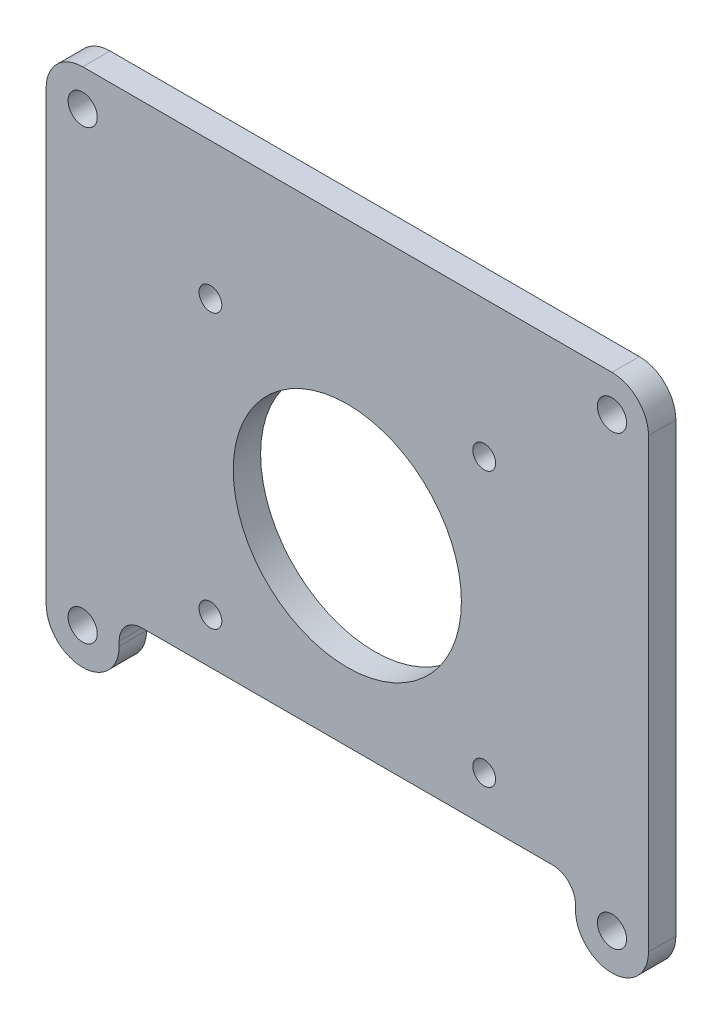
ISO-10303-21;
HEADER;
FILE_DESCRIPTION(('STEP AP214'),'2;1');
FILE_NAME('part.step','',(''),(''),'','','');
FILE_SCHEMA(('AUTOMOTIVE_DESIGN { 1 0 10303 214 1 1 1 1 }'));
ENDSEC;
DATA;
#1=APPLICATION_CONTEXT('core data for automotive mechanical design processes');
#2=APPLICATION_PROTOCOL_DEFINITION('international standard','automotive_design',2000,#1);
#3=PRODUCT_CONTEXT('',#1,'mechanical');
#4=PRODUCT('Part','Part','',(#3));
#5=PRODUCT_RELATED_PRODUCT_CATEGORY('part','',(#4));
#6=PRODUCT_DEFINITION_FORMATION('','',#4);
#7=PRODUCT_DEFINITION_CONTEXT('part definition',#1,'design');
#8=PRODUCT_DEFINITION('design','',#6,#7);
#9=PRODUCT_DEFINITION_SHAPE('','',#8);
#10=(LENGTH_UNIT() NAMED_UNIT(*) SI_UNIT(.MILLI.,.METRE.));
#11=(NAMED_UNIT(*) PLANE_ANGLE_UNIT() SI_UNIT($,.RADIAN.));
#12=(NAMED_UNIT(*) SI_UNIT($,.STERADIAN.) SOLID_ANGLE_UNIT());
#13=UNCERTAINTY_MEASURE_WITH_UNIT(LENGTH_MEASURE(1.E-05),#10,'distance_accuracy_value','');
#14=(GEOMETRIC_REPRESENTATION_CONTEXT(3) GLOBAL_UNCERTAINTY_ASSIGNED_CONTEXT((#13)) GLOBAL_UNIT_ASSIGNED_CONTEXT((#10,
#11,#12)) REPRESENTATION_CONTEXT('',''));
#15=CARTESIAN_POINT('',(0.,0.,0.));
#16=DIRECTION('',(0.,0.,1.));
#17=DIRECTION('',(1.,0.,0.));
#18=AXIS2_PLACEMENT_3D('',#15,#16,#17);
#19=CARTESIAN_POINT('',(-22.5,-2.5,3.));
#20=DIRECTION('',(0.,0.,-1.));
#21=DIRECTION('',(-1.,0.,0.));
#22=AXIS2_PLACEMENT_3D('',#19,#20,#21);
#23=PLANE('',#22);
#24=CARTESIAN_POINT('',(0.,20.,3.));
#25=DIRECTION('',(0.,0.,1.));
#26=DIRECTION('',(1.,0.,0.));
#27=AXIS2_PLACEMENT_3D('',#24,#25,#26);
#28=CIRCLE('',#27,12.5);
#29=CARTESIAN_POINT('',(12.5,20.,3.));
#30=VERTEX_POINT('',#29);
#31=EDGE_CURVE('E327',#30,#30,#28,.T.);
#32=ORIENTED_EDGE('',*,*,#31,.F.);
#33=EDGE_LOOP('',(#32));
#34=FACE_BOUND('',#33,.T.);
#35=CARTESIAN_POINT('',(15.,35.,3.));
#36=DIRECTION('',(0.,0.,1.));
#37=DIRECTION('',(1.,0.,0.));
#38=AXIS2_PLACEMENT_3D('',#35,#36,#37);
#39=CIRCLE('',#38,1.25);
#40=CARTESIAN_POINT('',(16.25,35.,3.));
#41=VERTEX_POINT('',#40);
#42=EDGE_CURVE('E321',#41,#41,#39,.T.);
#43=ORIENTED_EDGE('',*,*,#42,.F.);
#44=EDGE_LOOP('',(#43));
#45=FACE_BOUND('',#44,.T.);
#46=CARTESIAN_POINT('',(15.,5.,3.));
#47=DIRECTION('',(0.,0.,1.));
#48=DIRECTION('',(1.,0.,0.));
#49=AXIS2_PLACEMENT_3D('',#46,#47,#48);
#50=CIRCLE('',#49,1.25);
#51=CARTESIAN_POINT('',(16.25,5.,3.));
#52=VERTEX_POINT('',#51);
#53=EDGE_CURVE('E313',#52,#52,#50,.T.);
#54=ORIENTED_EDGE('',*,*,#53,.F.);
#55=EDGE_LOOP('',(#54));
#56=FACE_BOUND('',#55,.T.);
#57=CARTESIAN_POINT('',(-15.,5.,3.));
#58=DIRECTION('',(0.,0.,1.));
#59=DIRECTION('',(1.,0.,0.));
#60=AXIS2_PLACEMENT_3D('',#57,#58,#59);
#61=CIRCLE('',#60,1.25);
#62=CARTESIAN_POINT('',(-13.75,5.,3.));
#63=VERTEX_POINT('',#62);
#64=EDGE_CURVE('E306',#63,#63,#61,.T.);
#65=ORIENTED_EDGE('',*,*,#64,.F.);
#66=EDGE_LOOP('',(#65));
#67=FACE_BOUND('',#66,.T.);
#68=CARTESIAN_POINT('',(-15.,35.,3.));
#69=DIRECTION('',(0.,0.,1.));
#70=DIRECTION('',(1.,0.,0.));
#71=AXIS2_PLACEMENT_3D('',#68,#69,#70);
#72=CIRCLE('',#71,1.25);
#73=CARTESIAN_POINT('',(-13.75,35.,3.));
#74=VERTEX_POINT('',#73);
#75=EDGE_CURVE('E310',#74,#74,#72,.T.);
#76=ORIENTED_EDGE('',*,*,#75,.F.);
#77=EDGE_LOOP('',(#76));
#78=FACE_BOUND('',#77,.T.);
#79=CARTESIAN_POINT('',(-22.5,-2.5,3.));
#80=DIRECTION('',(0.,0.,-1.));
#81=DIRECTION('',(-1.,0.,0.));
#82=AXIS2_PLACEMENT_3D('',#79,#80,#81);
#83=CIRCLE('',#82,2.5);
#84=CARTESIAN_POINT('',(-25.,-2.5,3.));
#85=VERTEX_POINT('',#84);
#86=CARTESIAN_POINT('',(-22.5,0.,3.));
#87=VERTEX_POINT('',#86);
#88=EDGE_CURVE('E177',#85,#87,#83,.T.);
#89=ORIENTED_EDGE('',*,*,#88,.T.);
#90=DIRECTION('',(1.,0.,0.));
#91=VECTOR('',#90,1.);
#92=CARTESIAN_POINT('',(22.5,0.,3.));
#93=LINE('',#92,#91);
#94=CARTESIAN_POINT('',(22.5,0.,3.));
#95=VERTEX_POINT('',#94);
#96=EDGE_CURVE('E105',#87,#95,#93,.T.);
#97=ORIENTED_EDGE('',*,*,#96,.T.);
#98=CARTESIAN_POINT('',(22.5,-2.5,3.));
#99=DIRECTION('',(0.,0.,-1.));
#100=DIRECTION('',(1.,0.,0.));
#101=AXIS2_PLACEMENT_3D('',#98,#99,#100);
#102=CIRCLE('',#101,2.5);
#103=CARTESIAN_POINT('',(25.,-2.5,3.));
#104=VERTEX_POINT('',#103);
#105=EDGE_CURVE('E204',#95,#104,#102,.T.);
#106=ORIENTED_EDGE('',*,*,#105,.T.);
#107=DIRECTION('',(0.,-1.,0.));
#108=VECTOR('',#107,1.);
#109=CARTESIAN_POINT('',(25.,-2.5,3.));
#110=LINE('',#109,#108);
#111=CARTESIAN_POINT('',(25.,-3.00000000000001,3.));
#112=VERTEX_POINT('',#111);
#113=EDGE_CURVE('E223',#104,#112,#110,.T.);
#114=ORIENTED_EDGE('',*,*,#113,.T.);
#115=CARTESIAN_POINT('',(29.,-3.00000000000001,3.));
#116=DIRECTION('',(0.,0.,1.));
#117=DIRECTION('',(-1.,0.,0.));
#118=AXIS2_PLACEMENT_3D('',#115,#116,#117);
#119=CIRCLE('',#118,4.);
#120=CARTESIAN_POINT('',(33.,-3.00000000000001,3.));
#121=VERTEX_POINT('',#120);
#122=EDGE_CURVE('E220',#112,#121,#119,.T.);
#123=ORIENTED_EDGE('',*,*,#122,.T.);
#124=DIRECTION('',(0.,1.,0.));
#125=VECTOR('',#124,1.);
#126=CARTESIAN_POINT('',(33.,-3.00000000000001,3.));
#127=LINE('',#126,#125);
#128=CARTESIAN_POINT('',(33.,46.,3.));
#129=VERTEX_POINT('',#128);
#130=EDGE_CURVE('E222',#121,#129,#127,.T.);
#131=ORIENTED_EDGE('',*,*,#130,.T.);
#132=CARTESIAN_POINT('',(29.,46.,3.));
#133=DIRECTION('',(0.,0.,1.));
#134=DIRECTION('',(-1.,0.,0.));
#135=AXIS2_PLACEMENT_3D('',#132,#133,#134);
#136=CIRCLE('',#135,4.00000000000001);
#137=CARTESIAN_POINT('',(29.,50.,3.));
#138=VERTEX_POINT('',#137);
#139=EDGE_CURVE('E225',#129,#138,#136,.T.);
#140=ORIENTED_EDGE('',*,*,#139,.T.);
#141=DIRECTION('',(-1.,0.,0.));
#142=VECTOR('',#141,1.);
#143=CARTESIAN_POINT('',(-29.,50.,3.));
#144=LINE('',#143,#142);
#145=CARTESIAN_POINT('',(-29.,50.,3.));
#146=VERTEX_POINT('',#145);
#147=EDGE_CURVE('E231',#138,#146,#144,.T.);
#148=ORIENTED_EDGE('',*,*,#147,.T.);
#149=CARTESIAN_POINT('',(-29.,46.,3.));
#150=DIRECTION('',(0.,0.,1.));
#151=DIRECTION('',(1.,0.,0.));
#152=AXIS2_PLACEMENT_3D('',#149,#150,#151);
#153=CIRCLE('',#152,4.00000000000001);
#154=CARTESIAN_POINT('',(-33.,46.,3.));
#155=VERTEX_POINT('',#154);
#156=EDGE_CURVE('E136',#146,#155,#153,.T.);
#157=ORIENTED_EDGE('',*,*,#156,.T.);
#158=DIRECTION('',(0.,-1.,0.));
#159=VECTOR('',#158,1.);
#160=CARTESIAN_POINT('',(-33.,-3.00000000000001,3.));
#161=LINE('',#160,#159);
#162=CARTESIAN_POINT('',(-33.,-3.,3.));
#163=VERTEX_POINT('',#162);
#164=EDGE_CURVE('E130',#155,#163,#161,.T.);
#165=ORIENTED_EDGE('',*,*,#164,.T.);
#166=CARTESIAN_POINT('',(-29.,-3.00000000000001,3.));
#167=DIRECTION('',(0.,0.,1.));
#168=DIRECTION('',(1.,0.,0.));
#169=AXIS2_PLACEMENT_3D('',#166,#167,#168);
#170=CIRCLE('',#169,4.);
#171=CARTESIAN_POINT('',(-25.,-3.,3.));
#172=VERTEX_POINT('',#171);
#173=EDGE_CURVE('E134',#163,#172,#170,.T.);
#174=ORIENTED_EDGE('',*,*,#173,.T.);
#175=DIRECTION('',(0.,1.,0.));
#176=VECTOR('',#175,1.);
#177=CARTESIAN_POINT('',(-25.,-2.5,3.));
#178=LINE('',#177,#176);
#179=EDGE_CURVE('E50',#172,#85,#178,.T.);
#180=ORIENTED_EDGE('',*,*,#179,.T.);
#181=EDGE_LOOP('',(#89,#97,#106,#114,#123,#131,#140,#148,#157,#165,#174,#180));
#182=FACE_BOUND('',#181,.T.);
#183=CARTESIAN_POINT('',(-29.,-3.00000000000001,3.));
#184=DIRECTION('',(0.,0.,1.));
#185=DIRECTION('',(1.,0.,0.));
#186=AXIS2_PLACEMENT_3D('',#183,#184,#185);
#187=CIRCLE('',#186,1.6);
#188=CARTESIAN_POINT('',(-27.4,-3.00000000000001,3.));
#189=VERTEX_POINT('',#188);
#190=EDGE_CURVE('E158',#189,#189,#187,.T.);
#191=ORIENTED_EDGE('',*,*,#190,.F.);
#192=EDGE_LOOP('',(#191));
#193=FACE_BOUND('',#192,.T.);
#194=CARTESIAN_POINT('',(-29.,46.,3.));
#195=DIRECTION('',(0.,0.,1.));
#196=DIRECTION('',(1.,0.,0.));
#197=AXIS2_PLACEMENT_3D('',#194,#195,#196);
#198=CIRCLE('',#197,1.6);
#199=CARTESIAN_POINT('',(-27.4,46.,3.));
#200=VERTEX_POINT('',#199);
#201=EDGE_CURVE('E348',#200,#200,#198,.T.);
#202=ORIENTED_EDGE('',*,*,#201,.F.);
#203=EDGE_LOOP('',(#202));
#204=FACE_BOUND('',#203,.T.);
#205=CARTESIAN_POINT('',(29.,46.,3.));
#206=DIRECTION('',(0.,0.,1.));
#207=DIRECTION('',(-1.,0.,0.));
#208=AXIS2_PLACEMENT_3D('',#205,#206,#207);
#209=CIRCLE('',#208,1.6);
#210=CARTESIAN_POINT('',(27.4,46.,3.));
#211=VERTEX_POINT('',#210);
#212=EDGE_CURVE('E342',#211,#211,#209,.T.);
#213=ORIENTED_EDGE('',*,*,#212,.F.);
#214=EDGE_LOOP('',(#213));
#215=FACE_BOUND('',#214,.T.);
#216=CARTESIAN_POINT('',(29.,-3.00000000000001,3.));
#217=DIRECTION('',(0.,0.,1.));
#218=DIRECTION('',(-1.,0.,0.));
#219=AXIS2_PLACEMENT_3D('',#216,#217,#218);
#220=CIRCLE('',#219,1.6);
#221=CARTESIAN_POINT('',(27.4,-3.00000000000001,3.));
#222=VERTEX_POINT('',#221);
#223=EDGE_CURVE('E336',#222,#222,#220,.T.);
#224=ORIENTED_EDGE('',*,*,#223,.F.);
#225=EDGE_LOOP('',(#224));
#226=FACE_BOUND('',#225,.T.);
#227=ADVANCED_FACE('F33',(#34,#45,#56,#67,#78,#182,#193,#204,#215,#226),#23,.F.);
#228=CARTESIAN_POINT('',(-22.5,-2.5,0.));
#229=DIRECTION('',(0.,0.,-1.));
#230=DIRECTION('',(-1.,0.,0.));
#231=AXIS2_PLACEMENT_3D('',#228,#229,#230);
#232=PLANE('',#231);
#233=CARTESIAN_POINT('',(0.,20.,0.));
#234=DIRECTION('',(0.,0.,1.));
#235=DIRECTION('',(1.,0.,0.));
#236=AXIS2_PLACEMENT_3D('',#233,#234,#235);
#237=CIRCLE('',#236,12.5);
#238=CARTESIAN_POINT('',(12.5,20.,0.));
#239=VERTEX_POINT('',#238);
#240=EDGE_CURVE('E324',#239,#239,#237,.T.);
#241=ORIENTED_EDGE('',*,*,#240,.T.);
#242=EDGE_LOOP('',(#241));
#243=FACE_BOUND('',#242,.T.);
#244=CARTESIAN_POINT('',(15.,35.,0.));
#245=DIRECTION('',(0.,0.,1.));
#246=DIRECTION('',(1.,0.,0.));
#247=AXIS2_PLACEMENT_3D('',#244,#245,#246);
#248=CIRCLE('',#247,1.25);
#249=CARTESIAN_POINT('',(16.25,35.,0.));
#250=VERTEX_POINT('',#249);
#251=EDGE_CURVE('E318',#250,#250,#248,.T.);
#252=ORIENTED_EDGE('',*,*,#251,.T.);
#253=EDGE_LOOP('',(#252));
#254=FACE_BOUND('',#253,.T.);
#255=CARTESIAN_POINT('',(15.,5.,0.));
#256=DIRECTION('',(0.,0.,1.));
#257=DIRECTION('',(1.,0.,0.));
#258=AXIS2_PLACEMENT_3D('',#255,#256,#257);
#259=CIRCLE('',#258,1.25);
#260=CARTESIAN_POINT('',(16.25,5.,0.));
#261=VERTEX_POINT('',#260);
#262=EDGE_CURVE('E308',#261,#261,#259,.T.);
#263=ORIENTED_EDGE('',*,*,#262,.T.);
#264=EDGE_LOOP('',(#263));
#265=FACE_BOUND('',#264,.T.);
#266=CARTESIAN_POINT('',(-15.,5.,0.));
#267=DIRECTION('',(0.,0.,1.));
#268=DIRECTION('',(1.,0.,0.));
#269=AXIS2_PLACEMENT_3D('',#266,#267,#268);
#270=CIRCLE('',#269,1.25);
#271=CARTESIAN_POINT('',(-13.75,5.,0.));
#272=VERTEX_POINT('',#271);
#273=EDGE_CURVE('E303',#272,#272,#270,.T.);
#274=ORIENTED_EDGE('',*,*,#273,.T.);
#275=EDGE_LOOP('',(#274));
#276=FACE_BOUND('',#275,.T.);
#277=CARTESIAN_POINT('',(-15.,35.,0.));
#278=DIRECTION('',(0.,0.,1.));
#279=DIRECTION('',(1.,0.,0.));
#280=AXIS2_PLACEMENT_3D('',#277,#278,#279);
#281=CIRCLE('',#280,1.25);
#282=CARTESIAN_POINT('',(-13.75,35.,0.));
#283=VERTEX_POINT('',#282);
#284=EDGE_CURVE('E330',#283,#283,#281,.T.);
#285=ORIENTED_EDGE('',*,*,#284,.T.);
#286=EDGE_LOOP('',(#285));
#287=FACE_BOUND('',#286,.T.);
#288=CARTESIAN_POINT('',(29.,46.,0.));
#289=DIRECTION('',(0.,0.,1.));
#290=DIRECTION('',(-1.,0.,0.));
#291=AXIS2_PLACEMENT_3D('',#288,#289,#290);
#292=CIRCLE('',#291,1.6);
#293=CARTESIAN_POINT('',(27.4,46.,0.));
#294=VERTEX_POINT('',#293);
#295=EDGE_CURVE('E339',#294,#294,#292,.T.);
#296=ORIENTED_EDGE('',*,*,#295,.T.);
#297=EDGE_LOOP('',(#296));
#298=FACE_BOUND('',#297,.T.);
#299=CARTESIAN_POINT('',(-29.,-3.00000000000001,0.));
#300=DIRECTION('',(0.,0.,1.));
#301=DIRECTION('',(1.,0.,0.));
#302=AXIS2_PLACEMENT_3D('',#299,#300,#301);
#303=CIRCLE('',#302,1.6);
#304=CARTESIAN_POINT('',(-27.4,-3.00000000000001,0.));
#305=VERTEX_POINT('',#304);
#306=EDGE_CURVE('E351',#305,#305,#303,.T.);
#307=ORIENTED_EDGE('',*,*,#306,.T.);
#308=EDGE_LOOP('',(#307));
#309=FACE_BOUND('',#308,.T.);
#310=CARTESIAN_POINT('',(-22.5,-2.5,0.));
#311=DIRECTION('',(0.,0.,-1.));
#312=DIRECTION('',(-1.,0.,0.));
#313=AXIS2_PLACEMENT_3D('',#310,#311,#312);
#314=CIRCLE('',#313,2.5);
#315=CARTESIAN_POINT('',(-25.,-2.5,0.));
#316=VERTEX_POINT('',#315);
#317=CARTESIAN_POINT('',(-22.5,0.,0.));
#318=VERTEX_POINT('',#317);
#319=EDGE_CURVE('E154',#316,#318,#314,.T.);
#320=ORIENTED_EDGE('',*,*,#319,.F.);
#321=DIRECTION('',(0.,1.,0.));
#322=VECTOR('',#321,1.);
#323=CARTESIAN_POINT('',(-25.,-2.5,0.));
#324=LINE('',#323,#322);
#325=CARTESIAN_POINT('',(-25.,-3.,0.));
#326=VERTEX_POINT('',#325);
#327=EDGE_CURVE('E97',#326,#316,#324,.T.);
#328=ORIENTED_EDGE('',*,*,#327,.F.);
#329=CARTESIAN_POINT('',(-29.,-3.00000000000001,0.));
#330=DIRECTION('',(0.,0.,1.));
#331=DIRECTION('',(1.,0.,0.));
#332=AXIS2_PLACEMENT_3D('',#329,#330,#331);
#333=CIRCLE('',#332,4.);
#334=CARTESIAN_POINT('',(-33.,-3.,0.));
#335=VERTEX_POINT('',#334);
#336=EDGE_CURVE('E91',#335,#326,#333,.T.);
#337=ORIENTED_EDGE('',*,*,#336,.F.);
#338=DIRECTION('',(0.,-1.,0.));
#339=VECTOR('',#338,1.);
#340=CARTESIAN_POINT('',(-33.,-3.00000000000001,0.));
#341=LINE('',#340,#339);
#342=CARTESIAN_POINT('',(-33.,46.,0.));
#343=VERTEX_POINT('',#342);
#344=EDGE_CURVE('E144',#343,#335,#341,.T.);
#345=ORIENTED_EDGE('',*,*,#344,.F.);
#346=CARTESIAN_POINT('',(-29.,46.,0.));
#347=DIRECTION('',(0.,0.,1.));
#348=DIRECTION('',(1.,0.,0.));
#349=AXIS2_PLACEMENT_3D('',#346,#347,#348);
#350=CIRCLE('',#349,4.00000000000001);
#351=CARTESIAN_POINT('',(-29.,50.,0.));
#352=VERTEX_POINT('',#351);
#353=EDGE_CURVE('E172',#352,#343,#350,.T.);
#354=ORIENTED_EDGE('',*,*,#353,.F.);
#355=DIRECTION('',(-1.,0.,0.));
#356=VECTOR('',#355,1.);
#357=CARTESIAN_POINT('',(-29.,50.,0.));
#358=LINE('',#357,#356);
#359=CARTESIAN_POINT('',(29.,50.,0.));
#360=VERTEX_POINT('',#359);
#361=EDGE_CURVE('E170',#360,#352,#358,.T.);
#362=ORIENTED_EDGE('',*,*,#361,.F.);
#363=CARTESIAN_POINT('',(29.,46.,0.));
#364=DIRECTION('',(0.,0.,1.));
#365=DIRECTION('',(-1.,0.,0.));
#366=AXIS2_PLACEMENT_3D('',#363,#364,#365);
#367=CIRCLE('',#366,4.00000000000001);
#368=CARTESIAN_POINT('',(33.,46.,0.));
#369=VERTEX_POINT('',#368);
#370=EDGE_CURVE('E168',#369,#360,#367,.T.);
#371=ORIENTED_EDGE('',*,*,#370,.F.);
#372=DIRECTION('',(0.,1.,0.));
#373=VECTOR('',#372,1.);
#374=CARTESIAN_POINT('',(33.,-3.00000000000001,0.));
#375=LINE('',#374,#373);
#376=CARTESIAN_POINT('',(33.,-3.00000000000001,0.));
#377=VERTEX_POINT('',#376);
#378=EDGE_CURVE('E166',#377,#369,#375,.T.);
#379=ORIENTED_EDGE('',*,*,#378,.F.);
#380=CARTESIAN_POINT('',(29.,-3.00000000000001,0.));
#381=DIRECTION('',(0.,0.,1.));
#382=DIRECTION('',(-1.,0.,0.));
#383=AXIS2_PLACEMENT_3D('',#380,#381,#382);
#384=CIRCLE('',#383,4.);
#385=CARTESIAN_POINT('',(25.,-3.00000000000001,0.));
#386=VERTEX_POINT('',#385);
#387=EDGE_CURVE('E164',#386,#377,#384,.T.);
#388=ORIENTED_EDGE('',*,*,#387,.F.);
#389=DIRECTION('',(0.,-1.,0.));
#390=VECTOR('',#389,1.);
#391=CARTESIAN_POINT('',(25.,-2.5,0.));
#392=LINE('',#391,#390);
#393=CARTESIAN_POINT('',(25.,-2.5,0.));
#394=VERTEX_POINT('',#393);
#395=EDGE_CURVE('E162',#394,#386,#392,.T.);
#396=ORIENTED_EDGE('',*,*,#395,.F.);
#397=CARTESIAN_POINT('',(22.5,-2.5,0.));
#398=DIRECTION('',(0.,0.,-1.));
#399=DIRECTION('',(1.,0.,0.));
#400=AXIS2_PLACEMENT_3D('',#397,#398,#399);
#401=CIRCLE('',#400,2.5);
#402=CARTESIAN_POINT('',(22.5,0.,0.));
#403=VERTEX_POINT('',#402);
#404=EDGE_CURVE('E160',#403,#394,#401,.T.);
#405=ORIENTED_EDGE('',*,*,#404,.F.);
#406=DIRECTION('',(1.,0.,0.));
#407=VECTOR('',#406,1.);
#408=CARTESIAN_POINT('',(22.5,0.,0.));
#409=LINE('',#408,#407);
#410=EDGE_CURVE('E157',#318,#403,#409,.T.);
#411=ORIENTED_EDGE('',*,*,#410,.F.);
#412=EDGE_LOOP('',(#320,#328,#337,#345,#354,#362,#371,#379,#388,#396,#405,#411));
#413=FACE_BOUND('',#412,.T.);
#414=CARTESIAN_POINT('',(-29.,46.,0.));
#415=DIRECTION('',(0.,0.,1.));
#416=DIRECTION('',(1.,0.,0.));
#417=AXIS2_PLACEMENT_3D('',#414,#415,#416);
#418=CIRCLE('',#417,1.6);
#419=CARTESIAN_POINT('',(-27.4,46.,0.));
#420=VERTEX_POINT('',#419);
#421=EDGE_CURVE('E345',#420,#420,#418,.T.);
#422=ORIENTED_EDGE('',*,*,#421,.T.);
#423=EDGE_LOOP('',(#422));
#424=FACE_BOUND('',#423,.T.);
#425=CARTESIAN_POINT('',(29.,-3.00000000000001,0.));
#426=DIRECTION('',(0.,0.,1.));
#427=DIRECTION('',(-1.,0.,0.));
#428=AXIS2_PLACEMENT_3D('',#425,#426,#427);
#429=CIRCLE('',#428,1.6);
#430=CARTESIAN_POINT('',(27.4,-3.00000000000001,0.));
#431=VERTEX_POINT('',#430);
#432=EDGE_CURVE('E333',#431,#431,#429,.T.);
#433=ORIENTED_EDGE('',*,*,#432,.T.);
#434=EDGE_LOOP('',(#433));
#435=FACE_BOUND('',#434,.T.);
#436=ADVANCED_FACE('F208',(#243,#254,#265,#276,#287,#298,#309,#413,#424,#435),#232,.T.);
#437=CARTESIAN_POINT('',(-22.5,-2.5,3.));
#438=DIRECTION('',(0.,0.,-1.));
#439=DIRECTION('',(-1.,0.,0.));
#440=AXIS2_PLACEMENT_3D('',#437,#438,#439);
#441=CYLINDRICAL_SURFACE('',#440,2.5);
#442=ORIENTED_EDGE('',*,*,#319,.T.);
#443=DIRECTION('',(0.,0.,-1.));
#444=VECTOR('',#443,1.);
#445=CARTESIAN_POINT('',(-22.5,0.,3.));
#446=LINE('',#445,#444);
#447=EDGE_CURVE('E11',#87,#318,#446,.T.);
#448=ORIENTED_EDGE('',*,*,#447,.F.);
#449=ORIENTED_EDGE('',*,*,#88,.F.);
#450=DIRECTION('',(0.,0.,-1.));
#451=VECTOR('',#450,1.);
#452=CARTESIAN_POINT('',(-25.,-2.5,3.));
#453=LINE('',#452,#451);
#454=EDGE_CURVE('E150',#85,#316,#453,.T.);
#455=ORIENTED_EDGE('',*,*,#454,.T.);
#456=EDGE_LOOP('',(#442,#448,#449,#455));
#457=FACE_BOUND('',#456,.T.);
#458=ADVANCED_FACE('F35',(#457),#441,.F.);
#459=CARTESIAN_POINT('',(22.5,0.,3.));
#460=DIRECTION('',(0.,1.,0.));
#461=DIRECTION('',(0.,0.,1.));
#462=AXIS2_PLACEMENT_3D('',#459,#460,#461);
#463=PLANE('',#462);
#464=ORIENTED_EDGE('',*,*,#410,.T.);
#465=DIRECTION('',(0.,0.,-1.));
#466=VECTOR('',#465,1.);
#467=CARTESIAN_POINT('',(22.5,0.,3.));
#468=LINE('',#467,#466);
#469=EDGE_CURVE('E42',#95,#403,#468,.T.);
#470=ORIENTED_EDGE('',*,*,#469,.F.);
#471=ORIENTED_EDGE('',*,*,#96,.F.);
#472=ORIENTED_EDGE('',*,*,#447,.T.);
#473=EDGE_LOOP('',(#464,#470,#471,#472));
#474=FACE_BOUND('',#473,.T.);
#475=ADVANCED_FACE('F511',(#474),#463,.F.);
#476=CARTESIAN_POINT('',(22.5,-2.5,3.));
#477=DIRECTION('',(0.,0.,-1.));
#478=DIRECTION('',(-1.,0.,0.));
#479=AXIS2_PLACEMENT_3D('',#476,#477,#478);
#480=CYLINDRICAL_SURFACE('',#479,2.5);
#481=ORIENTED_EDGE('',*,*,#404,.T.);
#482=DIRECTION('',(0.,0.,-1.));
#483=VECTOR('',#482,1.);
#484=CARTESIAN_POINT('',(25.,-2.5,3.));
#485=LINE('',#484,#483);
#486=EDGE_CURVE('E196',#104,#394,#485,.T.);
#487=ORIENTED_EDGE('',*,*,#486,.F.);
#488=ORIENTED_EDGE('',*,*,#105,.F.);
#489=ORIENTED_EDGE('',*,*,#469,.T.);
#490=EDGE_LOOP('',(#481,#487,#488,#489));
#491=FACE_BOUND('',#490,.T.);
#492=ADVANCED_FACE('F202',(#491),#480,.F.);
#493=CARTESIAN_POINT('',(25.,-2.5,3.));
#494=DIRECTION('',(1.,0.,0.));
#495=DIRECTION('',(0.,0.,-1.));
#496=AXIS2_PLACEMENT_3D('',#493,#494,#495);
#497=PLANE('',#496);
#498=ORIENTED_EDGE('',*,*,#395,.T.);
#499=DIRECTION('',(0.,0.,-1.));
#500=VECTOR('',#499,1.);
#501=CARTESIAN_POINT('',(25.,-3.00000000000001,3.));
#502=LINE('',#501,#500);
#503=EDGE_CURVE('E193',#112,#386,#502,.T.);
#504=ORIENTED_EDGE('',*,*,#503,.F.);
#505=ORIENTED_EDGE('',*,*,#113,.F.);
#506=ORIENTED_EDGE('',*,*,#486,.T.);
#507=EDGE_LOOP('',(#498,#504,#505,#506));
#508=FACE_BOUND('',#507,.T.);
#509=ADVANCED_FACE('F214',(#508),#497,.F.);
#510=CARTESIAN_POINT('',(29.,-3.00000000000001,3.));
#511=DIRECTION('',(0.,0.,-1.));
#512=DIRECTION('',(-1.,0.,0.));
#513=AXIS2_PLACEMENT_3D('',#510,#511,#512);
#514=CYLINDRICAL_SURFACE('',#513,4.);
#515=ORIENTED_EDGE('',*,*,#387,.T.);
#516=DIRECTION('',(0.,0.,-1.));
#517=VECTOR('',#516,1.);
#518=CARTESIAN_POINT('',(33.,-3.00000000000001,3.));
#519=LINE('',#518,#517);
#520=EDGE_CURVE('E190',#121,#377,#519,.T.);
#521=ORIENTED_EDGE('',*,*,#520,.F.);
#522=ORIENTED_EDGE('',*,*,#122,.F.);
#523=ORIENTED_EDGE('',*,*,#503,.T.);
#524=EDGE_LOOP('',(#515,#521,#522,#523));
#525=FACE_BOUND('',#524,.T.);
#526=ADVANCED_FACE('F218',(#525),#514,.T.);
#527=CARTESIAN_POINT('',(33.,-3.00000000000001,3.));
#528=DIRECTION('',(-1.,0.,0.));
#529=DIRECTION('',(0.,-1.,0.));
#530=AXIS2_PLACEMENT_3D('',#527,#528,#529);
#531=PLANE('',#530);
#532=ORIENTED_EDGE('',*,*,#378,.T.);
#533=DIRECTION('',(0.,0.,-1.));
#534=VECTOR('',#533,1.);
#535=CARTESIAN_POINT('',(33.,46.,3.));
#536=LINE('',#535,#534);
#537=EDGE_CURVE('E187',#129,#369,#536,.T.);
#538=ORIENTED_EDGE('',*,*,#537,.F.);
#539=ORIENTED_EDGE('',*,*,#130,.F.);
#540=ORIENTED_EDGE('',*,*,#520,.T.);
#541=EDGE_LOOP('',(#532,#538,#539,#540));
#542=FACE_BOUND('',#541,.T.);
#543=ADVANCED_FACE('F480',(#542),#531,.F.);
#544=CARTESIAN_POINT('',(29.,46.,3.));
#545=DIRECTION('',(0.,0.,-1.));
#546=DIRECTION('',(-1.,0.,0.));
#547=AXIS2_PLACEMENT_3D('',#544,#545,#546);
#548=CYLINDRICAL_SURFACE('',#547,4.00000000000001);
#549=ORIENTED_EDGE('',*,*,#370,.T.);
#550=DIRECTION('',(0.,0.,-1.));
#551=VECTOR('',#550,1.);
#552=CARTESIAN_POINT('',(29.,50.,3.));
#553=LINE('',#552,#551);
#554=EDGE_CURVE('E184',#138,#360,#553,.T.);
#555=ORIENTED_EDGE('',*,*,#554,.F.);
#556=ORIENTED_EDGE('',*,*,#139,.F.);
#557=ORIENTED_EDGE('',*,*,#537,.T.);
#558=EDGE_LOOP('',(#549,#555,#556,#557));
#559=FACE_BOUND('',#558,.T.);
#560=ADVANCED_FACE('F472',(#559),#548,.T.);
#561=CARTESIAN_POINT('',(-29.,50.,3.));
#562=DIRECTION('',(0.,-1.,0.));
#563=DIRECTION('',(0.,0.,-1.));
#564=AXIS2_PLACEMENT_3D('',#561,#562,#563);
#565=PLANE('',#564);
#566=ORIENTED_EDGE('',*,*,#361,.T.);
#567=DIRECTION('',(0.,0.,-1.));
#568=VECTOR('',#567,1.);
#569=CARTESIAN_POINT('',(-29.,50.,3.));
#570=LINE('',#569,#568);
#571=EDGE_CURVE('E181',#146,#352,#570,.T.);
#572=ORIENTED_EDGE('',*,*,#571,.F.);
#573=ORIENTED_EDGE('',*,*,#147,.F.);
#574=ORIENTED_EDGE('',*,*,#554,.T.);
#575=EDGE_LOOP('',(#566,#572,#573,#574));
#576=FACE_BOUND('',#575,.T.);
#577=ADVANCED_FACE('F237',(#576),#565,.F.);
#578=CARTESIAN_POINT('',(-29.,46.,3.));
#579=DIRECTION('',(0.,0.,-1.));
#580=DIRECTION('',(-1.,0.,0.));
#581=AXIS2_PLACEMENT_3D('',#578,#579,#580);
#582=CYLINDRICAL_SURFACE('',#581,4.00000000000001);
#583=ORIENTED_EDGE('',*,*,#353,.T.);
#584=DIRECTION('',(0.,0.,-1.));
#585=VECTOR('',#584,1.);
#586=CARTESIAN_POINT('',(-33.,46.,3.));
#587=LINE('',#586,#585);
#588=EDGE_CURVE('E145',#155,#343,#587,.T.);
#589=ORIENTED_EDGE('',*,*,#588,.F.);
#590=ORIENTED_EDGE('',*,*,#156,.F.);
#591=ORIENTED_EDGE('',*,*,#571,.T.);
#592=EDGE_LOOP('',(#583,#589,#590,#591));
#593=FACE_BOUND('',#592,.T.);
#594=ADVANCED_FACE('F241',(#593),#582,.T.);
#595=CARTESIAN_POINT('',(-33.,-3.00000000000001,3.));
#596=DIRECTION('',(1.,0.,0.));
#597=DIRECTION('',(0.,1.,0.));
#598=AXIS2_PLACEMENT_3D('',#595,#596,#597);
#599=PLANE('',#598);
#600=ORIENTED_EDGE('',*,*,#344,.T.);
#601=DIRECTION('',(0.,0.,-1.));
#602=VECTOR('',#601,1.);
#603=CARTESIAN_POINT('',(-33.,-3.,3.));
#604=LINE('',#603,#602);
#605=EDGE_CURVE('E141',#163,#335,#604,.T.);
#606=ORIENTED_EDGE('',*,*,#605,.F.);
#607=ORIENTED_EDGE('',*,*,#164,.F.);
#608=ORIENTED_EDGE('',*,*,#588,.T.);
#609=EDGE_LOOP('',(#600,#606,#607,#608));
#610=FACE_BOUND('',#609,.T.);
#611=ADVANCED_FACE('F142',(#610),#599,.F.);
#612=CARTESIAN_POINT('',(-29.,-3.00000000000001,3.));
#613=DIRECTION('',(0.,0.,-1.));
#614=DIRECTION('',(-1.,0.,0.));
#615=AXIS2_PLACEMENT_3D('',#612,#613,#614);
#616=CYLINDRICAL_SURFACE('',#615,4.);
#617=ORIENTED_EDGE('',*,*,#336,.T.);
#618=DIRECTION('',(0.,0.,-1.));
#619=VECTOR('',#618,1.);
#620=CARTESIAN_POINT('',(-25.,-3.,3.));
#621=LINE('',#620,#619);
#622=EDGE_CURVE('E146',#172,#326,#621,.T.);
#623=ORIENTED_EDGE('',*,*,#622,.F.);
#624=ORIENTED_EDGE('',*,*,#173,.F.);
#625=ORIENTED_EDGE('',*,*,#605,.T.);
#626=EDGE_LOOP('',(#617,#623,#624,#625));
#627=FACE_BOUND('',#626,.T.);
#628=ADVANCED_FACE('F148',(#627),#616,.T.);
#629=CARTESIAN_POINT('',(-25.,-2.5,3.));
#630=DIRECTION('',(-1.,0.,0.));
#631=DIRECTION('',(0.,0.,1.));
#632=AXIS2_PLACEMENT_3D('',#629,#630,#631);
#633=PLANE('',#632);
#634=ORIENTED_EDGE('',*,*,#327,.T.);
#635=ORIENTED_EDGE('',*,*,#454,.F.);
#636=ORIENTED_EDGE('',*,*,#179,.F.);
#637=ORIENTED_EDGE('',*,*,#622,.T.);
#638=EDGE_LOOP('',(#634,#635,#636,#637));
#639=FACE_BOUND('',#638,.T.);
#640=ADVANCED_FACE('F245',(#639),#633,.F.);
#641=CARTESIAN_POINT('',(-29.,-3.00000000000001,3.));
#642=DIRECTION('',(0.,0.,-1.));
#643=DIRECTION('',(-1.,0.,0.));
#644=AXIS2_PLACEMENT_3D('',#641,#642,#643);
#645=CYLINDRICAL_SURFACE('',#644,1.6);
#646=ORIENTED_EDGE('',*,*,#190,.T.);
#647=EDGE_LOOP('',(#646));
#648=FACE_BOUND('',#647,.T.);
#649=ORIENTED_EDGE('',*,*,#306,.F.);
#650=EDGE_LOOP('',(#649));
#651=FACE_BOUND('',#650,.T.);
#652=ADVANCED_FACE('F247',(#648,#651),#645,.F.);
#653=CARTESIAN_POINT('',(-29.,46.,3.));
#654=DIRECTION('',(0.,0.,-1.));
#655=DIRECTION('',(-1.,0.,0.));
#656=AXIS2_PLACEMENT_3D('',#653,#654,#655);
#657=CYLINDRICAL_SURFACE('',#656,1.6);
#658=ORIENTED_EDGE('',*,*,#201,.T.);
#659=EDGE_LOOP('',(#658));
#660=FACE_BOUND('',#659,.T.);
#661=ORIENTED_EDGE('',*,*,#421,.F.);
#662=EDGE_LOOP('',(#661));
#663=FACE_BOUND('',#662,.T.);
#664=ADVANCED_FACE('F253',(#660,#663),#657,.F.);
#665=CARTESIAN_POINT('',(29.,46.,3.));
#666=DIRECTION('',(0.,0.,-1.));
#667=DIRECTION('',(-1.,0.,0.));
#668=AXIS2_PLACEMENT_3D('',#665,#666,#667);
#669=CYLINDRICAL_SURFACE('',#668,1.6);
#670=ORIENTED_EDGE('',*,*,#212,.T.);
#671=EDGE_LOOP('',(#670));
#672=FACE_BOUND('',#671,.T.);
#673=ORIENTED_EDGE('',*,*,#295,.F.);
#674=EDGE_LOOP('',(#673));
#675=FACE_BOUND('',#674,.T.);
#676=ADVANCED_FACE('F270',(#672,#675),#669,.F.);
#677=CARTESIAN_POINT('',(29.,-3.00000000000001,3.));
#678=DIRECTION('',(0.,0.,-1.));
#679=DIRECTION('',(-1.,0.,0.));
#680=AXIS2_PLACEMENT_3D('',#677,#678,#679);
#681=CYLINDRICAL_SURFACE('',#680,1.6);
#682=ORIENTED_EDGE('',*,*,#223,.T.);
#683=EDGE_LOOP('',(#682));
#684=FACE_BOUND('',#683,.T.);
#685=ORIENTED_EDGE('',*,*,#432,.F.);
#686=EDGE_LOOP('',(#685));
#687=FACE_BOUND('',#686,.T.);
#688=ADVANCED_FACE('F274',(#684,#687),#681,.F.);
#689=CARTESIAN_POINT('',(-15.,35.,0.));
#690=DIRECTION('',(0.,0.,1.));
#691=DIRECTION('',(1.,0.,0.));
#692=AXIS2_PLACEMENT_3D('',#689,#690,#691);
#693=CYLINDRICAL_SURFACE('',#692,1.25);
#694=ORIENTED_EDGE('',*,*,#284,.F.);
#695=EDGE_LOOP('',(#694));
#696=FACE_BOUND('',#695,.T.);
#697=ORIENTED_EDGE('',*,*,#75,.T.);
#698=EDGE_LOOP('',(#697));
#699=FACE_BOUND('',#698,.T.);
#700=ADVANCED_FACE('F278',(#696,#699),#693,.F.);
#701=CARTESIAN_POINT('',(-15.,5.,0.));
#702=DIRECTION('',(0.,0.,1.));
#703=DIRECTION('',(1.,0.,0.));
#704=AXIS2_PLACEMENT_3D('',#701,#702,#703);
#705=CYLINDRICAL_SURFACE('',#704,1.25);
#706=ORIENTED_EDGE('',*,*,#273,.F.);
#707=EDGE_LOOP('',(#706));
#708=FACE_BOUND('',#707,.T.);
#709=ORIENTED_EDGE('',*,*,#64,.T.);
#710=EDGE_LOOP('',(#709));
#711=FACE_BOUND('',#710,.T.);
#712=ADVANCED_FACE('F282',(#708,#711),#705,.F.);
#713=CARTESIAN_POINT('',(15.,5.,0.));
#714=DIRECTION('',(0.,0.,1.));
#715=DIRECTION('',(1.,0.,0.));
#716=AXIS2_PLACEMENT_3D('',#713,#714,#715);
#717=CYLINDRICAL_SURFACE('',#716,1.25);
#718=ORIENTED_EDGE('',*,*,#262,.F.);
#719=EDGE_LOOP('',(#718));
#720=FACE_BOUND('',#719,.T.);
#721=ORIENTED_EDGE('',*,*,#53,.T.);
#722=EDGE_LOOP('',(#721));
#723=FACE_BOUND('',#722,.T.);
#724=ADVANCED_FACE('F291',(#720,#723),#717,.F.);
#725=CARTESIAN_POINT('',(15.,35.,0.));
#726=DIRECTION('',(0.,0.,1.));
#727=DIRECTION('',(1.,0.,0.));
#728=AXIS2_PLACEMENT_3D('',#725,#726,#727);
#729=CYLINDRICAL_SURFACE('',#728,1.25);
#730=ORIENTED_EDGE('',*,*,#251,.F.);
#731=EDGE_LOOP('',(#730));
#732=FACE_BOUND('',#731,.T.);
#733=ORIENTED_EDGE('',*,*,#42,.T.);
#734=EDGE_LOOP('',(#733));
#735=FACE_BOUND('',#734,.T.);
#736=ADVANCED_FACE('F287',(#732,#735),#729,.F.);
#737=CARTESIAN_POINT('',(0.,20.,0.));
#738=DIRECTION('',(0.,0.,1.));
#739=DIRECTION('',(1.,0.,0.));
#740=AXIS2_PLACEMENT_3D('',#737,#738,#739);
#741=CYLINDRICAL_SURFACE('',#740,12.5);
#742=ORIENTED_EDGE('',*,*,#240,.F.);
#743=EDGE_LOOP('',(#742));
#744=FACE_BOUND('',#743,.T.);
#745=ORIENTED_EDGE('',*,*,#31,.T.);
#746=EDGE_LOOP('',(#745));
#747=FACE_BOUND('',#746,.T.);
#748=ADVANCED_FACE('F284',(#744,#747),#741,.F.);
#749=CLOSED_SHELL('',(#227,#436,#458,#475,#492,#509,#526,#543,#560,#577,#594,#611,#628,#640,
#652,#664,#676,#688,#700,#712,#724,#736,#748));
#750=MANIFOLD_SOLID_BREP('B2',#749);
#751=ADVANCED_BREP_SHAPE_REPRESENTATION('',(#18,#750),#14);
#752=SHAPE_DEFINITION_REPRESENTATION(#9,#751);
ENDSEC;
END-ISO-10303-21;
